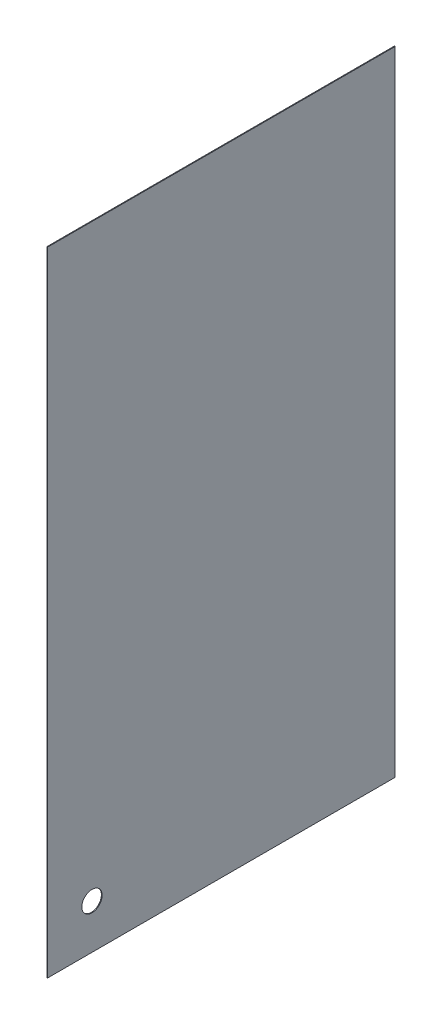
ISO-10303-21;
HEADER;
FILE_DESCRIPTION(('STEP AP214'),'2;1');
FILE_NAME('part.step','',(''),(''),'','','');
FILE_SCHEMA(('AUTOMOTIVE_DESIGN { 1 0 10303 214 1 1 1 1 }'));
ENDSEC;
DATA;
#1=APPLICATION_CONTEXT('core data for automotive mechanical design processes');
#2=APPLICATION_PROTOCOL_DEFINITION('international standard','automotive_design',2000,#1);
#3=PRODUCT_CONTEXT('',#1,'mechanical');
#4=PRODUCT('Part','Part','',(#3));
#5=PRODUCT_RELATED_PRODUCT_CATEGORY('part','',(#4));
#6=PRODUCT_DEFINITION_FORMATION('','',#4);
#7=PRODUCT_DEFINITION_CONTEXT('part definition',#1,'design');
#8=PRODUCT_DEFINITION('design','',#6,#7);
#9=PRODUCT_DEFINITION_SHAPE('','',#8);
#10=(LENGTH_UNIT() NAMED_UNIT(*) SI_UNIT(.MILLI.,.METRE.));
#11=(NAMED_UNIT(*) PLANE_ANGLE_UNIT() SI_UNIT($,.RADIAN.));
#12=(NAMED_UNIT(*) SI_UNIT($,.STERADIAN.) SOLID_ANGLE_UNIT());
#13=UNCERTAINTY_MEASURE_WITH_UNIT(LENGTH_MEASURE(1.E-05),#10,'distance_accuracy_value','');
#14=(GEOMETRIC_REPRESENTATION_CONTEXT(3) GLOBAL_UNCERTAINTY_ASSIGNED_CONTEXT((#13)) GLOBAL_UNIT_ASSIGNED_CONTEXT((#10,
#11,#12)) REPRESENTATION_CONTEXT('',''));
#15=CARTESIAN_POINT('',(0.,0.,0.));
#16=DIRECTION('',(0.,0.,1.));
#17=DIRECTION('',(1.,0.,0.));
#18=AXIS2_PLACEMENT_3D('',#15,#16,#17);
#19=CARTESIAN_POINT('',(1.2,998.,0.));
#20=DIRECTION('',(0.,0.,-1.));
#21=DIRECTION('',(0.,1.,0.));
#22=AXIS2_PLACEMENT_3D('',#19,#20,#21);
#23=PLANE('',#22);
#24=DIRECTION('',(0.,-1.,0.));
#25=VECTOR('',#24,1.);
#26=CARTESIAN_POINT('',(0.,998.,0.));
#27=LINE('',#26,#25);
#28=CARTESIAN_POINT('',(0.,998.,0.));
#29=VERTEX_POINT('',#28);
#30=CARTESIAN_POINT('',(0.,0.,0.));
#31=VERTEX_POINT('',#30);
#32=EDGE_CURVE('E102',#29,#31,#27,.T.);
#33=ORIENTED_EDGE('',*,*,#32,.T.);
#34=DIRECTION('',(-1.,0.,0.));
#35=VECTOR('',#34,1.);
#36=CARTESIAN_POINT('',(1.2,0.,0.));
#37=LINE('',#36,#35);
#38=CARTESIAN_POINT('',(1.2,0.,0.));
#39=VERTEX_POINT('',#38);
#40=EDGE_CURVE('E11',#39,#31,#37,.T.);
#41=ORIENTED_EDGE('',*,*,#40,.F.);
#42=DIRECTION('',(0.,-1.,0.));
#43=VECTOR('',#42,1.);
#44=CARTESIAN_POINT('',(1.2,998.,0.));
#45=LINE('',#44,#43);
#46=CARTESIAN_POINT('',(1.2,998.,0.));
#47=VERTEX_POINT('',#46);
#48=EDGE_CURVE('E90',#47,#39,#45,.T.);
#49=ORIENTED_EDGE('',*,*,#48,.F.);
#50=DIRECTION('',(-1.,0.,0.));
#51=VECTOR('',#50,1.);
#52=CARTESIAN_POINT('',(1.2,998.,0.));
#53=LINE('',#52,#51);
#54=EDGE_CURVE('E98',#47,#29,#53,.T.);
#55=ORIENTED_EDGE('',*,*,#54,.T.);
#56=EDGE_LOOP('',(#33,#41,#49,#55));
#57=FACE_BOUND('',#56,.T.);
#58=ADVANCED_FACE('F39',(#57),#23,.F.);
#59=CARTESIAN_POINT('',(1.2,0.,-548.));
#60=DIRECTION('',(0.,1.,0.));
#61=DIRECTION('',(0.,0.,1.));
#62=AXIS2_PLACEMENT_3D('',#59,#60,#61);
#63=PLANE('',#62);
#64=DIRECTION('',(0.,0.,-1.));
#65=VECTOR('',#64,1.);
#66=CARTESIAN_POINT('',(0.,0.,-548.));
#67=LINE('',#66,#65);
#68=CARTESIAN_POINT('',(0.,0.,-548.));
#69=VERTEX_POINT('',#68);
#70=EDGE_CURVE('E94',#31,#69,#67,.T.);
#71=ORIENTED_EDGE('',*,*,#70,.T.);
#72=DIRECTION('',(-1.,0.,0.));
#73=VECTOR('',#72,1.);
#74=CARTESIAN_POINT('',(1.2,0.,-548.));
#75=LINE('',#74,#73);
#76=CARTESIAN_POINT('',(1.2,0.,-548.));
#77=VERTEX_POINT('',#76);
#78=EDGE_CURVE('E47',#77,#69,#75,.T.);
#79=ORIENTED_EDGE('',*,*,#78,.F.);
#80=DIRECTION('',(0.,0.,-1.));
#81=VECTOR('',#80,1.);
#82=CARTESIAN_POINT('',(1.2,0.,-548.));
#83=LINE('',#82,#81);
#84=EDGE_CURVE('E85',#39,#77,#83,.T.);
#85=ORIENTED_EDGE('',*,*,#84,.F.);
#86=ORIENTED_EDGE('',*,*,#40,.T.);
#87=EDGE_LOOP('',(#71,#79,#85,#86));
#88=FACE_BOUND('',#87,.T.);
#89=ADVANCED_FACE('F93',(#88),#63,.F.);
#90=CARTESIAN_POINT('',(1.2,998.,-548.));
#91=DIRECTION('',(0.,0.,1.));
#92=DIRECTION('',(1.,0.,0.));
#93=AXIS2_PLACEMENT_3D('',#90,#91,#92);
#94=PLANE('',#93);
#95=DIRECTION('',(0.,1.,0.));
#96=VECTOR('',#95,1.);
#97=CARTESIAN_POINT('',(0.,998.,-548.));
#98=LINE('',#97,#96);
#99=CARTESIAN_POINT('',(0.,998.,-548.));
#100=VERTEX_POINT('',#99);
#101=EDGE_CURVE('E72',#69,#100,#98,.T.);
#102=ORIENTED_EDGE('',*,*,#101,.T.);
#103=DIRECTION('',(-1.,0.,0.));
#104=VECTOR('',#103,1.);
#105=CARTESIAN_POINT('',(1.2,998.,-548.));
#106=LINE('',#105,#104);
#107=CARTESIAN_POINT('',(1.2,998.,-548.));
#108=VERTEX_POINT('',#107);
#109=EDGE_CURVE('E95',#108,#100,#106,.T.);
#110=ORIENTED_EDGE('',*,*,#109,.F.);
#111=DIRECTION('',(0.,1.,0.));
#112=VECTOR('',#111,1.);
#113=CARTESIAN_POINT('',(1.2,998.,-548.));
#114=LINE('',#113,#112);
#115=EDGE_CURVE('E88',#77,#108,#114,.T.);
#116=ORIENTED_EDGE('',*,*,#115,.F.);
#117=ORIENTED_EDGE('',*,*,#78,.T.);
#118=EDGE_LOOP('',(#102,#110,#116,#117));
#119=FACE_BOUND('',#118,.T.);
#120=ADVANCED_FACE('F96',(#119),#94,.F.);
#121=CARTESIAN_POINT('',(1.2,998.,-548.));
#122=DIRECTION('',(0.,-1.,0.));
#123=DIRECTION('',(0.,0.,-1.));
#124=AXIS2_PLACEMENT_3D('',#121,#122,#123);
#125=PLANE('',#124);
#126=DIRECTION('',(0.,0.,1.));
#127=VECTOR('',#126,1.);
#128=CARTESIAN_POINT('',(0.,998.,-548.));
#129=LINE('',#128,#127);
#130=EDGE_CURVE('E78',#100,#29,#129,.T.);
#131=ORIENTED_EDGE('',*,*,#130,.T.);
#132=ORIENTED_EDGE('',*,*,#54,.F.);
#133=DIRECTION('',(0.,0.,1.));
#134=VECTOR('',#133,1.);
#135=CARTESIAN_POINT('',(1.2,998.,-548.));
#136=LINE('',#135,#134);
#137=EDGE_CURVE('E55',#108,#47,#136,.T.);
#138=ORIENTED_EDGE('',*,*,#137,.F.);
#139=ORIENTED_EDGE('',*,*,#109,.T.);
#140=EDGE_LOOP('',(#131,#132,#138,#139));
#141=FACE_BOUND('',#140,.T.);
#142=ADVANCED_FACE('F110',(#141),#125,.F.);
#143=CARTESIAN_POINT('',(1.2,0.,0.));
#144=DIRECTION('',(-1.,0.,0.));
#145=DIRECTION('',(0.,0.,1.));
#146=AXIS2_PLACEMENT_3D('',#143,#144,#145);
#147=PLANE('',#146);
#148=CARTESIAN_POINT('',(1.2,70.0000000000001,-70.0000000000001));
#149=DIRECTION('',(1.,0.,0.));
#150=DIRECTION('',(0.,0.,-1.));
#151=AXIS2_PLACEMENT_3D('',#148,#149,#150);
#152=CIRCLE('',#151,16.);
#153=CARTESIAN_POINT('',(1.2,70.0000000000001,-86.0000000000001));
#154=VERTEX_POINT('',#153);
#155=EDGE_CURVE('E116',#154,#154,#152,.T.);
#156=ORIENTED_EDGE('',*,*,#155,.F.);
#157=EDGE_LOOP('',(#156));
#158=FACE_BOUND('',#157,.T.);
#159=ORIENTED_EDGE('',*,*,#48,.T.);
#160=ORIENTED_EDGE('',*,*,#84,.T.);
#161=ORIENTED_EDGE('',*,*,#115,.T.);
#162=ORIENTED_EDGE('',*,*,#137,.T.);
#163=EDGE_LOOP('',(#159,#160,#161,#162));
#164=FACE_BOUND('',#163,.T.);
#165=ADVANCED_FACE('F86',(#158,#164),#147,.F.);
#166=CARTESIAN_POINT('',(0.,0.,0.));
#167=DIRECTION('',(-1.,0.,0.));
#168=DIRECTION('',(0.,0.,1.));
#169=AXIS2_PLACEMENT_3D('',#166,#167,#168);
#170=PLANE('',#169);
#171=CARTESIAN_POINT('',(0.,70.0000000000001,-70.0000000000001));
#172=DIRECTION('',(1.,0.,0.));
#173=DIRECTION('',(0.,0.,-1.));
#174=AXIS2_PLACEMENT_3D('',#171,#172,#173);
#175=CIRCLE('',#174,16.);
#176=CARTESIAN_POINT('',(0.,70.0000000000001,-86.0000000000001));
#177=VERTEX_POINT('',#176);
#178=EDGE_CURVE('E105',#177,#177,#175,.T.);
#179=ORIENTED_EDGE('',*,*,#178,.T.);
#180=EDGE_LOOP('',(#179));
#181=FACE_BOUND('',#180,.T.);
#182=ORIENTED_EDGE('',*,*,#32,.F.);
#183=ORIENTED_EDGE('',*,*,#130,.F.);
#184=ORIENTED_EDGE('',*,*,#101,.F.);
#185=ORIENTED_EDGE('',*,*,#70,.F.);
#186=EDGE_LOOP('',(#182,#183,#184,#185));
#187=FACE_BOUND('',#186,.T.);
#188=ADVANCED_FACE('F113',(#181,#187),#170,.T.);
#189=CARTESIAN_POINT('',(0.,70.0000000000001,-70.0000000000001));
#190=DIRECTION('',(1.,0.,0.));
#191=DIRECTION('',(0.,0.,-1.));
#192=AXIS2_PLACEMENT_3D('',#189,#190,#191);
#193=CYLINDRICAL_SURFACE('',#192,16.);
#194=ORIENTED_EDGE('',*,*,#178,.F.);
#195=EDGE_LOOP('',(#194));
#196=FACE_BOUND('',#195,.T.);
#197=ORIENTED_EDGE('',*,*,#155,.T.);
#198=EDGE_LOOP('',(#197));
#199=FACE_BOUND('',#198,.T.);
#200=ADVANCED_FACE('F123',(#196,#199),#193,.F.);
#201=CLOSED_SHELL('',(#58,#89,#120,#142,#165,#188,#200));
#202=MANIFOLD_SOLID_BREP('B2',#201);
#203=ADVANCED_BREP_SHAPE_REPRESENTATION('',(#18,#202),#14);
#204=SHAPE_DEFINITION_REPRESENTATION(#9,#203);
ENDSEC;
END-ISO-10303-21;
